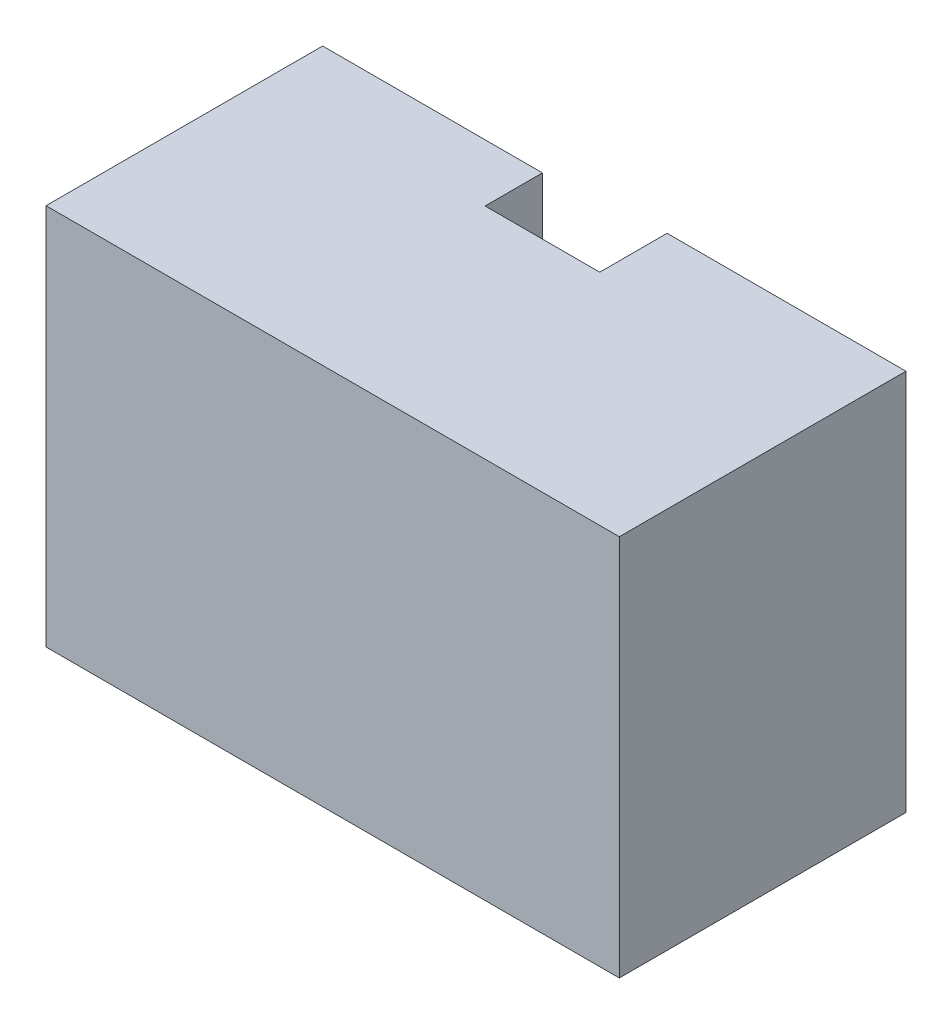
ISO-10303-21;
HEADER;
FILE_DESCRIPTION(('STEP AP214'),'2;1');
FILE_NAME('part.step','',(''),(''),'','','');
FILE_SCHEMA(('AUTOMOTIVE_DESIGN { 1 0 10303 214 1 1 1 1 }'));
ENDSEC;
DATA;
#1=APPLICATION_CONTEXT('core data for automotive mechanical design processes');
#2=APPLICATION_PROTOCOL_DEFINITION('international standard','automotive_design',2000,#1);
#3=PRODUCT_CONTEXT('',#1,'mechanical');
#4=PRODUCT('Part','Part','',(#3));
#5=PRODUCT_RELATED_PRODUCT_CATEGORY('part','',(#4));
#6=PRODUCT_DEFINITION_FORMATION('','',#4);
#7=PRODUCT_DEFINITION_CONTEXT('part definition',#1,'design');
#8=PRODUCT_DEFINITION('design','',#6,#7);
#9=PRODUCT_DEFINITION_SHAPE('','',#8);
#10=(LENGTH_UNIT() NAMED_UNIT(*) SI_UNIT(.MILLI.,.METRE.));
#11=(NAMED_UNIT(*) PLANE_ANGLE_UNIT() SI_UNIT($,.RADIAN.));
#12=(NAMED_UNIT(*) SI_UNIT($,.STERADIAN.) SOLID_ANGLE_UNIT());
#13=UNCERTAINTY_MEASURE_WITH_UNIT(LENGTH_MEASURE(1.E-05),#10,'distance_accuracy_value','');
#14=(GEOMETRIC_REPRESENTATION_CONTEXT(3) GLOBAL_UNCERTAINTY_ASSIGNED_CONTEXT((#13)) GLOBAL_UNIT_ASSIGNED_CONTEXT((#10,
#11,#12)) REPRESENTATION_CONTEXT('',''));
#15=CARTESIAN_POINT('',(0.,0.,0.));
#16=DIRECTION('',(0.,0.,1.));
#17=DIRECTION('',(1.,0.,0.));
#18=AXIS2_PLACEMENT_3D('',#15,#16,#17);
#19=CARTESIAN_POINT('',(0.,200.,0.));
#20=DIRECTION('',(1.,0.,0.));
#21=DIRECTION('',(0.,0.,-1.));
#22=AXIS2_PLACEMENT_3D('',#19,#20,#21);
#23=PLANE('',#22);
#24=DIRECTION('',(0.,0.,1.));
#25=VECTOR('',#24,1.);
#26=CARTESIAN_POINT('',(0.,-200.,0.));
#27=LINE('',#26,#25);
#28=CARTESIAN_POINT('',(0.,-200.,-289.5));
#29=VERTEX_POINT('',#28);
#30=CARTESIAN_POINT('',(0.,-200.,0.));
#31=VERTEX_POINT('',#30);
#32=EDGE_CURVE('E134',#29,#31,#27,.T.);
#33=ORIENTED_EDGE('',*,*,#32,.T.);
#34=DIRECTION('',(0.,-1.,0.));
#35=VECTOR('',#34,1.);
#36=CARTESIAN_POINT('',(0.,200.,0.));
#37=LINE('',#36,#35);
#38=CARTESIAN_POINT('',(0.,200.,0.));
#39=VERTEX_POINT('',#38);
#40=EDGE_CURVE('E42',#39,#31,#37,.T.);
#41=ORIENTED_EDGE('',*,*,#40,.F.);
#42=DIRECTION('',(0.,0.,1.));
#43=VECTOR('',#42,1.);
#44=CARTESIAN_POINT('',(0.,200.,0.));
#45=LINE('',#44,#43);
#46=CARTESIAN_POINT('',(0.,200.,-289.5));
#47=VERTEX_POINT('',#46);
#48=EDGE_CURVE('E94',#47,#39,#45,.T.);
#49=ORIENTED_EDGE('',*,*,#48,.F.);
#50=DIRECTION('',(0.,-1.,0.));
#51=VECTOR('',#50,1.);
#52=CARTESIAN_POINT('',(0.,200.,-289.5));
#53=LINE('',#52,#51);
#54=EDGE_CURVE('E11',#47,#29,#53,.T.);
#55=ORIENTED_EDGE('',*,*,#54,.T.);
#56=EDGE_LOOP('',(#33,#41,#49,#55));
#57=FACE_BOUND('',#56,.T.);
#58=ADVANCED_FACE('F34',(#57),#23,.F.);
#59=CARTESIAN_POINT('',(600.,200.,0.));
#60=DIRECTION('',(0.,0.,-1.));
#61=DIRECTION('',(-1.,0.,0.));
#62=AXIS2_PLACEMENT_3D('',#59,#60,#61);
#63=PLANE('',#62);
#64=DIRECTION('',(1.,0.,0.));
#65=VECTOR('',#64,1.);
#66=CARTESIAN_POINT('',(600.,-200.,0.));
#67=LINE('',#66,#65);
#68=CARTESIAN_POINT('',(600.,-200.,0.));
#69=VERTEX_POINT('',#68);
#70=EDGE_CURVE('E137',#31,#69,#67,.T.);
#71=ORIENTED_EDGE('',*,*,#70,.T.);
#72=DIRECTION('',(0.,-1.,0.));
#73=VECTOR('',#72,1.);
#74=CARTESIAN_POINT('',(600.,200.,0.));
#75=LINE('',#74,#73);
#76=CARTESIAN_POINT('',(600.,200.,0.));
#77=VERTEX_POINT('',#76);
#78=EDGE_CURVE('E154',#77,#69,#75,.T.);
#79=ORIENTED_EDGE('',*,*,#78,.F.);
#80=DIRECTION('',(1.,0.,0.));
#81=VECTOR('',#80,1.);
#82=CARTESIAN_POINT('',(100.,200.,0.));
#83=LINE('',#82,#81);
#84=EDGE_CURVE('E161',#39,#77,#83,.T.);
#85=ORIENTED_EDGE('',*,*,#84,.F.);
#86=ORIENTED_EDGE('',*,*,#40,.T.);
#87=EDGE_LOOP('',(#71,#79,#85,#86));
#88=FACE_BOUND('',#87,.T.);
#89=ADVANCED_FACE('F159',(#88),#63,.F.);
#90=CARTESIAN_POINT('',(600.,200.,-300.));
#91=DIRECTION('',(-1.,0.,0.));
#92=DIRECTION('',(0.,0.,1.));
#93=AXIS2_PLACEMENT_3D('',#90,#91,#92);
#94=PLANE('',#93);
#95=DIRECTION('',(0.,0.,-1.));
#96=VECTOR('',#95,1.);
#97=CARTESIAN_POINT('',(600.,-200.,-300.));
#98=LINE('',#97,#96);
#99=CARTESIAN_POINT('',(600.,-200.,-300.));
#100=VERTEX_POINT('',#99);
#101=EDGE_CURVE('E139',#69,#100,#98,.T.);
#102=ORIENTED_EDGE('',*,*,#101,.T.);
#103=DIRECTION('',(0.,-1.,0.));
#104=VECTOR('',#103,1.);
#105=CARTESIAN_POINT('',(600.,200.,-300.));
#106=LINE('',#105,#104);
#107=CARTESIAN_POINT('',(600.,200.,-300.));
#108=VERTEX_POINT('',#107);
#109=EDGE_CURVE('E151',#108,#100,#106,.T.);
#110=ORIENTED_EDGE('',*,*,#109,.F.);
#111=DIRECTION('',(0.,0.,-1.));
#112=VECTOR('',#111,1.);
#113=CARTESIAN_POINT('',(600.,200.,-300.));
#114=LINE('',#113,#112);
#115=EDGE_CURVE('E174',#77,#108,#114,.T.);
#116=ORIENTED_EDGE('',*,*,#115,.F.);
#117=ORIENTED_EDGE('',*,*,#78,.T.);
#118=EDGE_LOOP('',(#102,#110,#116,#117));
#119=FACE_BOUND('',#118,.T.);
#120=ADVANCED_FACE('F170',(#119),#94,.F.);
#121=CARTESIAN_POINT('',(350.,200.,-300.));
#122=DIRECTION('',(0.,0.,1.));
#123=DIRECTION('',(1.,0.,0.));
#124=AXIS2_PLACEMENT_3D('',#121,#122,#123);
#125=PLANE('',#124);
#126=DIRECTION('',(-1.,0.,0.));
#127=VECTOR('',#126,1.);
#128=CARTESIAN_POINT('',(350.,-200.,-300.));
#129=LINE('',#128,#127);
#130=CARTESIAN_POINT('',(350.,-200.,-300.));
#131=VERTEX_POINT('',#130);
#132=EDGE_CURVE('E141',#100,#131,#129,.T.);
#133=ORIENTED_EDGE('',*,*,#132,.T.);
#134=DIRECTION('',(0.,-1.,0.));
#135=VECTOR('',#134,1.);
#136=CARTESIAN_POINT('',(350.,200.,-300.));
#137=LINE('',#136,#135);
#138=CARTESIAN_POINT('',(350.,200.,-300.));
#139=VERTEX_POINT('',#138);
#140=EDGE_CURVE('E123',#139,#131,#137,.T.);
#141=ORIENTED_EDGE('',*,*,#140,.F.);
#142=DIRECTION('',(-1.,0.,0.));
#143=VECTOR('',#142,1.);
#144=CARTESIAN_POINT('',(350.,200.,-300.));
#145=LINE('',#144,#143);
#146=EDGE_CURVE('E114',#108,#139,#145,.T.);
#147=ORIENTED_EDGE('',*,*,#146,.F.);
#148=ORIENTED_EDGE('',*,*,#109,.T.);
#149=EDGE_LOOP('',(#133,#141,#147,#148));
#150=FACE_BOUND('',#149,.T.);
#151=ADVANCED_FACE('F173',(#150),#125,.F.);
#152=CARTESIAN_POINT('',(350.,200.,-229.5));
#153=DIRECTION('',(1.,0.,0.));
#154=DIRECTION('',(0.,0.,-1.));
#155=AXIS2_PLACEMENT_3D('',#152,#153,#154);
#156=PLANE('',#155);
#157=DIRECTION('',(0.,0.,1.));
#158=VECTOR('',#157,1.);
#159=CARTESIAN_POINT('',(350.,-200.,-229.5));
#160=LINE('',#159,#158);
#161=CARTESIAN_POINT('',(350.,-200.,-229.5));
#162=VERTEX_POINT('',#161);
#163=EDGE_CURVE('E122',#131,#162,#160,.T.);
#164=ORIENTED_EDGE('',*,*,#163,.T.);
#165=DIRECTION('',(0.,-1.,0.));
#166=VECTOR('',#165,1.);
#167=CARTESIAN_POINT('',(350.,200.,-229.5));
#168=LINE('',#167,#166);
#169=CARTESIAN_POINT('',(350.,200.,-229.5));
#170=VERTEX_POINT('',#169);
#171=EDGE_CURVE('E119',#170,#162,#168,.T.);
#172=ORIENTED_EDGE('',*,*,#171,.F.);
#173=DIRECTION('',(0.,0.,1.));
#174=VECTOR('',#173,1.);
#175=CARTESIAN_POINT('',(350.,200.,-229.5));
#176=LINE('',#175,#174);
#177=EDGE_CURVE('E108',#139,#170,#176,.T.);
#178=ORIENTED_EDGE('',*,*,#177,.F.);
#179=ORIENTED_EDGE('',*,*,#140,.T.);
#180=EDGE_LOOP('',(#164,#172,#178,#179));
#181=FACE_BOUND('',#180,.T.);
#182=ADVANCED_FACE('F120',(#181),#156,.F.);
#183=CARTESIAN_POINT('',(230.,200.,-229.5));
#184=DIRECTION('',(0.,0.,1.));
#185=DIRECTION('',(1.,0.,0.));
#186=AXIS2_PLACEMENT_3D('',#183,#184,#185);
#187=PLANE('',#186);
#188=DIRECTION('',(-1.,0.,0.));
#189=VECTOR('',#188,1.);
#190=CARTESIAN_POINT('',(230.,-200.,-229.5));
#191=LINE('',#190,#189);
#192=CARTESIAN_POINT('',(230.,-200.,-229.5));
#193=VERTEX_POINT('',#192);
#194=EDGE_CURVE('E80',#162,#193,#191,.T.);
#195=ORIENTED_EDGE('',*,*,#194,.T.);
#196=DIRECTION('',(0.,-1.,0.));
#197=VECTOR('',#196,1.);
#198=CARTESIAN_POINT('',(230.,200.,-229.5));
#199=LINE('',#198,#197);
#200=CARTESIAN_POINT('',(230.,200.,-229.5));
#201=VERTEX_POINT('',#200);
#202=EDGE_CURVE('E124',#201,#193,#199,.T.);
#203=ORIENTED_EDGE('',*,*,#202,.F.);
#204=DIRECTION('',(-1.,0.,0.));
#205=VECTOR('',#204,1.);
#206=CARTESIAN_POINT('',(230.,200.,-229.5));
#207=LINE('',#206,#205);
#208=EDGE_CURVE('E112',#170,#201,#207,.T.);
#209=ORIENTED_EDGE('',*,*,#208,.F.);
#210=ORIENTED_EDGE('',*,*,#171,.T.);
#211=EDGE_LOOP('',(#195,#203,#209,#210));
#212=FACE_BOUND('',#211,.T.);
#213=ADVANCED_FACE('F126',(#212),#187,.F.);
#214=CARTESIAN_POINT('',(230.,200.,-289.5));
#215=DIRECTION('',(-1.,0.,0.));
#216=DIRECTION('',(0.,0.,1.));
#217=AXIS2_PLACEMENT_3D('',#214,#215,#216);
#218=PLANE('',#217);
#219=DIRECTION('',(0.,0.,-1.));
#220=VECTOR('',#219,1.);
#221=CARTESIAN_POINT('',(230.,-200.,-289.5));
#222=LINE('',#221,#220);
#223=CARTESIAN_POINT('',(230.,-200.,-289.5));
#224=VERTEX_POINT('',#223);
#225=EDGE_CURVE('E87',#193,#224,#222,.T.);
#226=ORIENTED_EDGE('',*,*,#225,.T.);
#227=DIRECTION('',(0.,-1.,0.));
#228=VECTOR('',#227,1.);
#229=CARTESIAN_POINT('',(230.,200.,-289.5));
#230=LINE('',#229,#228);
#231=CARTESIAN_POINT('',(230.,200.,-289.5));
#232=VERTEX_POINT('',#231);
#233=EDGE_CURVE('E130',#232,#224,#230,.T.);
#234=ORIENTED_EDGE('',*,*,#233,.F.);
#235=DIRECTION('',(0.,0.,-1.));
#236=VECTOR('',#235,1.);
#237=CARTESIAN_POINT('',(230.,200.,-289.5));
#238=LINE('',#237,#236);
#239=EDGE_CURVE('E128',#201,#232,#238,.T.);
#240=ORIENTED_EDGE('',*,*,#239,.F.);
#241=ORIENTED_EDGE('',*,*,#202,.T.);
#242=EDGE_LOOP('',(#226,#234,#240,#241));
#243=FACE_BOUND('',#242,.T.);
#244=ADVANCED_FACE('F180',(#243),#218,.F.);
#245=CARTESIAN_POINT('',(89.9999999999999,200.,-289.5));
#246=DIRECTION('',(0.,0.,1.));
#247=DIRECTION('',(1.,0.,0.));
#248=AXIS2_PLACEMENT_3D('',#245,#246,#247);
#249=PLANE('',#248);
#250=DIRECTION('',(-1.,0.,0.));
#251=VECTOR('',#250,1.);
#252=CARTESIAN_POINT('',(89.9999999999999,-200.,-289.5));
#253=LINE('',#252,#251);
#254=EDGE_CURVE('E146',#224,#29,#253,.T.);
#255=ORIENTED_EDGE('',*,*,#254,.T.);
#256=ORIENTED_EDGE('',*,*,#54,.F.);
#257=DIRECTION('',(-1.,0.,0.));
#258=VECTOR('',#257,1.);
#259=CARTESIAN_POINT('',(0.,200.,-289.5));
#260=LINE('',#259,#258);
#261=EDGE_CURVE('E50',#232,#47,#260,.T.);
#262=ORIENTED_EDGE('',*,*,#261,.F.);
#263=ORIENTED_EDGE('',*,*,#233,.T.);
#264=EDGE_LOOP('',(#255,#256,#262,#263));
#265=FACE_BOUND('',#264,.T.);
#266=ADVANCED_FACE('F179',(#265),#249,.F.);
#267=CARTESIAN_POINT('',(0.,200.,0.));
#268=DIRECTION('',(0.,-1.,0.));
#269=DIRECTION('',(0.,0.,-1.));
#270=AXIS2_PLACEMENT_3D('',#267,#268,#269);
#271=PLANE('',#270);
#272=ORIENTED_EDGE('',*,*,#261,.T.);
#273=ORIENTED_EDGE('',*,*,#48,.T.);
#274=ORIENTED_EDGE('',*,*,#84,.T.);
#275=ORIENTED_EDGE('',*,*,#115,.T.);
#276=ORIENTED_EDGE('',*,*,#146,.T.);
#277=ORIENTED_EDGE('',*,*,#177,.T.);
#278=ORIENTED_EDGE('',*,*,#208,.T.);
#279=ORIENTED_EDGE('',*,*,#239,.T.);
#280=EDGE_LOOP('',(#272,#273,#274,#275,#276,#277,#278,#279));
#281=FACE_BOUND('',#280,.T.);
#282=ADVANCED_FACE('F110',(#281),#271,.F.);
#283=CARTESIAN_POINT('',(0.,-200.,0.));
#284=DIRECTION('',(0.,-1.,0.));
#285=DIRECTION('',(0.,0.,-1.));
#286=AXIS2_PLACEMENT_3D('',#283,#284,#285);
#287=PLANE('',#286);
#288=ORIENTED_EDGE('',*,*,#32,.F.);
#289=ORIENTED_EDGE('',*,*,#254,.F.);
#290=ORIENTED_EDGE('',*,*,#225,.F.);
#291=ORIENTED_EDGE('',*,*,#194,.F.);
#292=ORIENTED_EDGE('',*,*,#163,.F.);
#293=ORIENTED_EDGE('',*,*,#132,.F.);
#294=ORIENTED_EDGE('',*,*,#101,.F.);
#295=ORIENTED_EDGE('',*,*,#70,.F.);
#296=EDGE_LOOP('',(#288,#289,#290,#291,#292,#293,#294,#295));
#297=FACE_BOUND('',#296,.T.);
#298=ADVANCED_FACE('F165',(#297),#287,.T.);
#299=CLOSED_SHELL('',(#58,#89,#120,#151,#182,#213,#244,#266,#282,#298));
#300=MANIFOLD_SOLID_BREP('B2',#299);
#301=ADVANCED_BREP_SHAPE_REPRESENTATION('',(#18,#300),#14);
#302=SHAPE_DEFINITION_REPRESENTATION(#9,#301);
ENDSEC;
END-ISO-10303-21;
